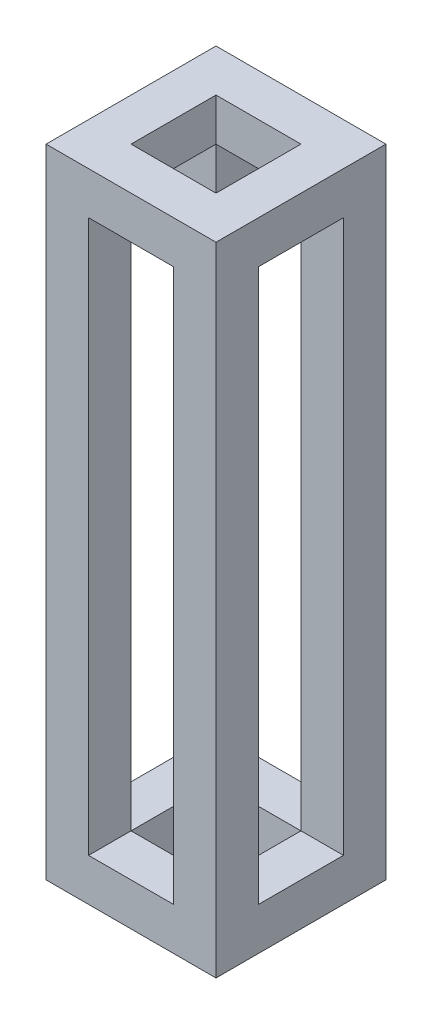
ISO-10303-21;
HEADER;
FILE_DESCRIPTION(('STEP AP214'),'2;1');
FILE_NAME('part.step','',(''),(''),'','','');
FILE_SCHEMA(('AUTOMOTIVE_DESIGN { 1 0 10303 214 1 1 1 1 }'));
ENDSEC;
DATA;
#1=APPLICATION_CONTEXT('core data for automotive mechanical design processes');
#2=APPLICATION_PROTOCOL_DEFINITION('international standard','automotive_design',2000,#1);
#3=PRODUCT_CONTEXT('',#1,'mechanical');
#4=PRODUCT('Part','Part','',(#3));
#5=PRODUCT_RELATED_PRODUCT_CATEGORY('part','',(#4));
#6=PRODUCT_DEFINITION_FORMATION('','',#4);
#7=PRODUCT_DEFINITION_CONTEXT('part definition',#1,'design');
#8=PRODUCT_DEFINITION('design','',#6,#7);
#9=PRODUCT_DEFINITION_SHAPE('','',#8);
#10=(LENGTH_UNIT() NAMED_UNIT(*) SI_UNIT(.MILLI.,.METRE.));
#11=(NAMED_UNIT(*) PLANE_ANGLE_UNIT() SI_UNIT($,.RADIAN.));
#12=(NAMED_UNIT(*) SI_UNIT($,.STERADIAN.) SOLID_ANGLE_UNIT());
#13=UNCERTAINTY_MEASURE_WITH_UNIT(LENGTH_MEASURE(1.E-05),#10,'distance_accuracy_value','');
#14=(GEOMETRIC_REPRESENTATION_CONTEXT(3) GLOBAL_UNCERTAINTY_ASSIGNED_CONTEXT((#13)) GLOBAL_UNIT_ASSIGNED_CONTEXT((#10,
#11,#12)) REPRESENTATION_CONTEXT('',''));
#15=CARTESIAN_POINT('',(0.,0.,0.));
#16=DIRECTION('',(0.,0.,1.));
#17=DIRECTION('',(1.,0.,0.));
#18=AXIS2_PLACEMENT_3D('',#15,#16,#17);
#19=CARTESIAN_POINT('',(-20.,0.,-40.));
#20=DIRECTION('',(1.,0.,0.));
#21=DIRECTION('',(0.,0.,-1.));
#22=AXIS2_PLACEMENT_3D('',#19,#20,#21);
#23=PLANE('',#22);
#24=DIRECTION('',(0.,1.,0.));
#25=VECTOR('',#24,1.);
#26=CARTESIAN_POINT('',(-20.,0.,-40.));
#27=LINE('',#26,#25);
#28=CARTESIAN_POINT('',(-20.,20.,-40.));
#29=VERTEX_POINT('',#28);
#30=CARTESIAN_POINT('',(-20.,280.,-40.));
#31=VERTEX_POINT('',#30);
#32=EDGE_CURVE('E253',#29,#31,#27,.T.);
#33=ORIENTED_EDGE('',*,*,#32,.T.);
#34=DIRECTION('',(0.,0.,1.));
#35=VECTOR('',#34,1.);
#36=CARTESIAN_POINT('',(-20.,280.,-40.));
#37=LINE('',#36,#35);
#38=CARTESIAN_POINT('',(-20.,280.,-20.));
#39=VERTEX_POINT('',#38);
#40=EDGE_CURVE('E246',#31,#39,#37,.T.);
#41=ORIENTED_EDGE('',*,*,#40,.T.);
#42=DIRECTION('',(0.,1.,0.));
#43=VECTOR('',#42,1.);
#44=CARTESIAN_POINT('',(-20.,0.,-20.));
#45=LINE('',#44,#43);
#46=CARTESIAN_POINT('',(-20.,20.,-20.));
#47=VERTEX_POINT('',#46);
#48=EDGE_CURVE('E254',#47,#39,#45,.T.);
#49=ORIENTED_EDGE('',*,*,#48,.F.);
#50=DIRECTION('',(0.,0.,-1.));
#51=VECTOR('',#50,1.);
#52=CARTESIAN_POINT('',(-20.,20.,0.));
#53=LINE('',#52,#51);
#54=EDGE_CURVE('E326',#47,#29,#53,.T.);
#55=ORIENTED_EDGE('',*,*,#54,.T.);
#56=EDGE_LOOP('',(#33,#41,#49,#55));
#57=FACE_BOUND('',#56,.T.);
#58=ADVANCED_FACE('F39',(#57),#23,.T.);
#59=CARTESIAN_POINT('',(-40.,0.,-20.));
#60=DIRECTION('',(0.,0.,1.));
#61=DIRECTION('',(1.,0.,0.));
#62=AXIS2_PLACEMENT_3D('',#59,#60,#61);
#63=PLANE('',#62);
#64=ORIENTED_EDGE('',*,*,#48,.T.);
#65=DIRECTION('',(-1.,0.,0.));
#66=VECTOR('',#65,1.);
#67=CARTESIAN_POINT('',(-40.,280.,-20.));
#68=LINE('',#67,#66);
#69=CARTESIAN_POINT('',(-40.,280.,-20.));
#70=VERTEX_POINT('',#69);
#71=EDGE_CURVE('E371',#39,#70,#68,.T.);
#72=ORIENTED_EDGE('',*,*,#71,.T.);
#73=DIRECTION('',(0.,1.,0.));
#74=VECTOR('',#73,1.);
#75=CARTESIAN_POINT('',(-40.,0.,-20.));
#76=LINE('',#75,#74);
#77=CARTESIAN_POINT('',(-40.,20.,-20.));
#78=VERTEX_POINT('',#77);
#79=EDGE_CURVE('E256',#78,#70,#76,.T.);
#80=ORIENTED_EDGE('',*,*,#79,.F.);
#81=DIRECTION('',(1.,0.,0.));
#82=VECTOR('',#81,1.);
#83=CARTESIAN_POINT('',(0.,20.,-20.));
#84=LINE('',#83,#82);
#85=EDGE_CURVE('E323',#78,#47,#84,.T.);
#86=ORIENTED_EDGE('',*,*,#85,.T.);
#87=EDGE_LOOP('',(#64,#72,#80,#86));
#88=FACE_BOUND('',#87,.T.);
#89=ADVANCED_FACE('F425',(#88),#63,.T.);
#90=CARTESIAN_POINT('',(20.,0.,-20.));
#91=DIRECTION('',(-1.,0.,0.));
#92=DIRECTION('',(0.,0.,1.));
#93=AXIS2_PLACEMENT_3D('',#90,#91,#92);
#94=PLANE('',#93);
#95=DIRECTION('',(0.,1.,0.));
#96=VECTOR('',#95,1.);
#97=CARTESIAN_POINT('',(20.,0.,-20.));
#98=LINE('',#97,#96);
#99=CARTESIAN_POINT('',(20.,20.,-20.));
#100=VERTEX_POINT('',#99);
#101=CARTESIAN_POINT('',(20.,280.,-20.));
#102=VERTEX_POINT('',#101);
#103=EDGE_CURVE('E374',#100,#102,#98,.T.);
#104=ORIENTED_EDGE('',*,*,#103,.T.);
#105=DIRECTION('',(0.,0.,-1.));
#106=VECTOR('',#105,1.);
#107=CARTESIAN_POINT('',(20.,280.,-20.));
#108=LINE('',#107,#106);
#109=CARTESIAN_POINT('',(20.,280.,-40.));
#110=VERTEX_POINT('',#109);
#111=EDGE_CURVE('E366',#102,#110,#108,.T.);
#112=ORIENTED_EDGE('',*,*,#111,.T.);
#113=DIRECTION('',(0.,1.,0.));
#114=VECTOR('',#113,1.);
#115=CARTESIAN_POINT('',(20.,0.,-40.));
#116=LINE('',#115,#114);
#117=CARTESIAN_POINT('',(20.,20.,-40.));
#118=VERTEX_POINT('',#117);
#119=EDGE_CURVE('E239',#118,#110,#116,.T.);
#120=ORIENTED_EDGE('',*,*,#119,.F.);
#121=DIRECTION('',(0.,0.,1.));
#122=VECTOR('',#121,1.);
#123=CARTESIAN_POINT('',(20.,20.,0.));
#124=LINE('',#123,#122);
#125=EDGE_CURVE('E335',#118,#100,#124,.T.);
#126=ORIENTED_EDGE('',*,*,#125,.T.);
#127=EDGE_LOOP('',(#104,#112,#120,#126));
#128=FACE_BOUND('',#127,.T.);
#129=ADVANCED_FACE('F427',(#128),#94,.T.);
#130=CARTESIAN_POINT('',(20.,0.,-20.));
#131=DIRECTION('',(0.,0.,1.));
#132=DIRECTION('',(1.,0.,0.));
#133=AXIS2_PLACEMENT_3D('',#130,#131,#132);
#134=PLANE('',#133);
#135=DIRECTION('',(0.,1.,0.));
#136=VECTOR('',#135,1.);
#137=CARTESIAN_POINT('',(40.,0.,-20.));
#138=LINE('',#137,#136);
#139=CARTESIAN_POINT('',(40.,20.,-20.));
#140=VERTEX_POINT('',#139);
#141=CARTESIAN_POINT('',(40.,280.,-20.));
#142=VERTEX_POINT('',#141);
#143=EDGE_CURVE('E378',#140,#142,#138,.T.);
#144=ORIENTED_EDGE('',*,*,#143,.T.);
#145=DIRECTION('',(-1.,0.,0.));
#146=VECTOR('',#145,1.);
#147=CARTESIAN_POINT('',(20.,280.,-20.));
#148=LINE('',#147,#146);
#149=EDGE_CURVE('E224',#142,#102,#148,.T.);
#150=ORIENTED_EDGE('',*,*,#149,.T.);
#151=ORIENTED_EDGE('',*,*,#103,.F.);
#152=DIRECTION('',(1.,0.,0.));
#153=VECTOR('',#152,1.);
#154=CARTESIAN_POINT('',(0.,20.,-20.));
#155=LINE('',#154,#153);
#156=EDGE_CURVE('E328',#100,#140,#155,.T.);
#157=ORIENTED_EDGE('',*,*,#156,.T.);
#158=EDGE_LOOP('',(#144,#150,#151,#157));
#159=FACE_BOUND('',#158,.T.);
#160=ADVANCED_FACE('F475',(#159),#134,.T.);
#161=CARTESIAN_POINT('',(20.,0.,20.));
#162=DIRECTION('',(-1.,0.,0.));
#163=DIRECTION('',(0.,0.,1.));
#164=AXIS2_PLACEMENT_3D('',#161,#162,#163);
#165=PLANE('',#164);
#166=DIRECTION('',(0.,1.,0.));
#167=VECTOR('',#166,1.);
#168=CARTESIAN_POINT('',(20.,0.,40.));
#169=LINE('',#168,#167);
#170=CARTESIAN_POINT('',(20.,20.,40.));
#171=VERTEX_POINT('',#170);
#172=CARTESIAN_POINT('',(20.,280.,40.));
#173=VERTEX_POINT('',#172);
#174=EDGE_CURVE('E225',#171,#173,#169,.T.);
#175=ORIENTED_EDGE('',*,*,#174,.T.);
#176=DIRECTION('',(0.,0.,-1.));
#177=VECTOR('',#176,1.);
#178=CARTESIAN_POINT('',(20.,280.,20.));
#179=LINE('',#178,#177);
#180=CARTESIAN_POINT('',(20.,280.,20.));
#181=VERTEX_POINT('',#180);
#182=EDGE_CURVE('E181',#173,#181,#179,.T.);
#183=ORIENTED_EDGE('',*,*,#182,.T.);
#184=DIRECTION('',(0.,1.,0.));
#185=VECTOR('',#184,1.);
#186=CARTESIAN_POINT('',(20.,0.,20.));
#187=LINE('',#186,#185);
#188=CARTESIAN_POINT('',(20.,20.,20.));
#189=VERTEX_POINT('',#188);
#190=EDGE_CURVE('E219',#189,#181,#187,.T.);
#191=ORIENTED_EDGE('',*,*,#190,.F.);
#192=DIRECTION('',(0.,0.,1.));
#193=VECTOR('',#192,1.);
#194=CARTESIAN_POINT('',(20.,20.,0.));
#195=LINE('',#194,#193);
#196=EDGE_CURVE('E336',#189,#171,#195,.T.);
#197=ORIENTED_EDGE('',*,*,#196,.T.);
#198=EDGE_LOOP('',(#175,#183,#191,#197));
#199=FACE_BOUND('',#198,.T.);
#200=ADVANCED_FACE('F217',(#199),#165,.T.);
#201=CARTESIAN_POINT('',(20.,0.,20.));
#202=DIRECTION('',(0.,0.,-1.));
#203=DIRECTION('',(-1.,0.,0.));
#204=AXIS2_PLACEMENT_3D('',#201,#202,#203);
#205=PLANE('',#204);
#206=ORIENTED_EDGE('',*,*,#190,.T.);
#207=DIRECTION('',(1.,0.,0.));
#208=VECTOR('',#207,1.);
#209=CARTESIAN_POINT('',(20.,280.,20.));
#210=LINE('',#209,#208);
#211=CARTESIAN_POINT('',(40.,280.,20.));
#212=VERTEX_POINT('',#211);
#213=EDGE_CURVE('E173',#181,#212,#210,.T.);
#214=ORIENTED_EDGE('',*,*,#213,.T.);
#215=DIRECTION('',(0.,1.,0.));
#216=VECTOR('',#215,1.);
#217=CARTESIAN_POINT('',(40.,0.,20.));
#218=LINE('',#217,#216);
#219=CARTESIAN_POINT('',(40.,20.,20.));
#220=VERTEX_POINT('',#219);
#221=EDGE_CURVE('E229',#220,#212,#218,.T.);
#222=ORIENTED_EDGE('',*,*,#221,.F.);
#223=DIRECTION('',(-1.,0.,0.));
#224=VECTOR('',#223,1.);
#225=CARTESIAN_POINT('',(0.,20.,20.));
#226=LINE('',#225,#224);
#227=EDGE_CURVE('E227',#220,#189,#226,.T.);
#228=ORIENTED_EDGE('',*,*,#227,.T.);
#229=EDGE_LOOP('',(#206,#214,#222,#228));
#230=FACE_BOUND('',#229,.T.);
#231=ADVANCED_FACE('F226',(#230),#205,.T.);
#232=CARTESIAN_POINT('',(-20.,0.,20.));
#233=DIRECTION('',(1.,0.,0.));
#234=DIRECTION('',(0.,0.,-1.));
#235=AXIS2_PLACEMENT_3D('',#232,#233,#234);
#236=PLANE('',#235);
#237=DIRECTION('',(0.,1.,0.));
#238=VECTOR('',#237,1.);
#239=CARTESIAN_POINT('',(-20.,0.,20.));
#240=LINE('',#239,#238);
#241=CARTESIAN_POINT('',(-20.,20.,20.));
#242=VERTEX_POINT('',#241);
#243=CARTESIAN_POINT('',(-20.,280.,20.));
#244=VERTEX_POINT('',#243);
#245=EDGE_CURVE('E238',#242,#244,#240,.T.);
#246=ORIENTED_EDGE('',*,*,#245,.T.);
#247=DIRECTION('',(0.,0.,1.));
#248=VECTOR('',#247,1.);
#249=CARTESIAN_POINT('',(-20.,280.,20.));
#250=LINE('',#249,#248);
#251=CARTESIAN_POINT('',(-20.,280.,40.));
#252=VERTEX_POINT('',#251);
#253=EDGE_CURVE('E184',#244,#252,#250,.T.);
#254=ORIENTED_EDGE('',*,*,#253,.T.);
#255=DIRECTION('',(0.,1.,0.));
#256=VECTOR('',#255,1.);
#257=CARTESIAN_POINT('',(-20.,0.,40.));
#258=LINE('',#257,#256);
#259=CARTESIAN_POINT('',(-20.,20.,40.));
#260=VERTEX_POINT('',#259);
#261=EDGE_CURVE('E247',#260,#252,#258,.T.);
#262=ORIENTED_EDGE('',*,*,#261,.F.);
#263=DIRECTION('',(0.,0.,-1.));
#264=VECTOR('',#263,1.);
#265=CARTESIAN_POINT('',(-20.,20.,0.));
#266=LINE('',#265,#264);
#267=EDGE_CURVE('E50',#260,#242,#266,.T.);
#268=ORIENTED_EDGE('',*,*,#267,.T.);
#269=EDGE_LOOP('',(#246,#254,#262,#268));
#270=FACE_BOUND('',#269,.T.);
#271=ADVANCED_FACE('F341',(#270),#236,.T.);
#272=CARTESIAN_POINT('',(-20.,0.,20.));
#273=DIRECTION('',(0.,0.,-1.));
#274=DIRECTION('',(-1.,0.,0.));
#275=AXIS2_PLACEMENT_3D('',#272,#273,#274);
#276=PLANE('',#275);
#277=DIRECTION('',(0.,1.,0.));
#278=VECTOR('',#277,1.);
#279=CARTESIAN_POINT('',(-40.,0.,20.));
#280=LINE('',#279,#278);
#281=CARTESIAN_POINT('',(-40.,20.,20.));
#282=VERTEX_POINT('',#281);
#283=CARTESIAN_POINT('',(-40.,280.,20.));
#284=VERTEX_POINT('',#283);
#285=EDGE_CURVE('E244',#282,#284,#280,.T.);
#286=ORIENTED_EDGE('',*,*,#285,.T.);
#287=DIRECTION('',(1.,0.,0.));
#288=VECTOR('',#287,1.);
#289=CARTESIAN_POINT('',(-20.,280.,20.));
#290=LINE('',#289,#288);
#291=EDGE_CURVE('E11',#284,#244,#290,.T.);
#292=ORIENTED_EDGE('',*,*,#291,.T.);
#293=ORIENTED_EDGE('',*,*,#245,.F.);
#294=DIRECTION('',(-1.,0.,0.));
#295=VECTOR('',#294,1.);
#296=CARTESIAN_POINT('',(0.,20.,20.));
#297=LINE('',#296,#295);
#298=EDGE_CURVE('E339',#242,#282,#297,.T.);
#299=ORIENTED_EDGE('',*,*,#298,.T.);
#300=EDGE_LOOP('',(#286,#292,#293,#299));
#301=FACE_BOUND('',#300,.T.);
#302=ADVANCED_FACE('F349',(#301),#276,.T.);
#303=CARTESIAN_POINT('',(0.,20.,0.));
#304=DIRECTION('',(0.,1.,0.));
#305=DIRECTION('',(0.,0.,1.));
#306=AXIS2_PLACEMENT_3D('',#303,#304,#305);
#307=PLANE('',#306);
#308=ORIENTED_EDGE('',*,*,#267,.F.);
#309=DIRECTION('',(1.,0.,0.));
#310=VECTOR('',#309,1.);
#311=CARTESIAN_POINT('',(-40.,20.,40.));
#312=LINE('',#311,#310);
#313=EDGE_CURVE('E305',#260,#171,#312,.T.);
#314=ORIENTED_EDGE('',*,*,#313,.T.);
#315=ORIENTED_EDGE('',*,*,#196,.F.);
#316=DIRECTION('',(1.,0.,0.));
#317=VECTOR('',#316,1.);
#318=CARTESIAN_POINT('',(-20.,20.,20.));
#319=LINE('',#318,#317);
#320=EDGE_CURVE('E275',#242,#189,#319,.T.);
#321=ORIENTED_EDGE('',*,*,#320,.F.);
#322=EDGE_LOOP('',(#308,#314,#315,#321));
#323=FACE_BOUND('',#322,.T.);
#324=ADVANCED_FACE('F420',(#323),#307,.T.);
#325=ORIENTED_EDGE('',*,*,#298,.F.);
#326=DIRECTION('',(0.,0.,1.));
#327=VECTOR('',#326,1.);
#328=CARTESIAN_POINT('',(-20.,20.,-20.));
#329=LINE('',#328,#327);
#330=EDGE_CURVE('E267',#47,#242,#329,.T.);
#331=ORIENTED_EDGE('',*,*,#330,.F.);
#332=ORIENTED_EDGE('',*,*,#85,.F.);
#333=DIRECTION('',(0.,0.,1.));
#334=VECTOR('',#333,1.);
#335=CARTESIAN_POINT('',(-40.,20.,-40.));
#336=LINE('',#335,#334);
#337=EDGE_CURVE('E302',#78,#282,#336,.T.);
#338=ORIENTED_EDGE('',*,*,#337,.T.);
#339=EDGE_LOOP('',(#325,#331,#332,#338));
#340=FACE_BOUND('',#339,.T.);
#341=ADVANCED_FACE('F458',(#340),#307,.T.);
#342=ORIENTED_EDGE('',*,*,#125,.F.);
#343=DIRECTION('',(-1.,0.,0.));
#344=VECTOR('',#343,1.);
#345=CARTESIAN_POINT('',(-40.,20.,-40.));
#346=LINE('',#345,#344);
#347=EDGE_CURVE('E299',#118,#29,#346,.T.);
#348=ORIENTED_EDGE('',*,*,#347,.T.);
#349=ORIENTED_EDGE('',*,*,#54,.F.);
#350=DIRECTION('',(-1.,0.,0.));
#351=VECTOR('',#350,1.);
#352=CARTESIAN_POINT('',(-20.,20.,-20.));
#353=LINE('',#352,#351);
#354=EDGE_CURVE('E264',#100,#47,#353,.T.);
#355=ORIENTED_EDGE('',*,*,#354,.F.);
#356=EDGE_LOOP('',(#342,#348,#349,#355));
#357=FACE_BOUND('',#356,.T.);
#358=ADVANCED_FACE('F418',(#357),#307,.T.);
#359=ORIENTED_EDGE('',*,*,#227,.F.);
#360=DIRECTION('',(0.,0.,-1.));
#361=VECTOR('',#360,1.);
#362=CARTESIAN_POINT('',(40.,20.,-40.));
#363=LINE('',#362,#361);
#364=EDGE_CURVE('E296',#220,#140,#363,.T.);
#365=ORIENTED_EDGE('',*,*,#364,.T.);
#366=ORIENTED_EDGE('',*,*,#156,.F.);
#367=DIRECTION('',(0.,0.,-1.));
#368=VECTOR('',#367,1.);
#369=CARTESIAN_POINT('',(20.,20.,-20.));
#370=LINE('',#369,#368);
#371=EDGE_CURVE('E265',#189,#100,#370,.T.);
#372=ORIENTED_EDGE('',*,*,#371,.F.);
#373=EDGE_LOOP('',(#359,#365,#366,#372));
#374=FACE_BOUND('',#373,.T.);
#375=ADVANCED_FACE('F409',(#374),#307,.T.);
#376=CARTESIAN_POINT('',(0.,0.,0.));
#377=DIRECTION('',(0.,1.,0.));
#378=DIRECTION('',(0.,0.,1.));
#379=AXIS2_PLACEMENT_3D('',#376,#377,#378);
#380=PLANE('',#379);
#381=DIRECTION('',(0.,0.,1.));
#382=VECTOR('',#381,1.);
#383=CARTESIAN_POINT('',(-20.,0.,-20.));
#384=LINE('',#383,#382);
#385=CARTESIAN_POINT('',(-20.,0.,-20.));
#386=VERTEX_POINT('',#385);
#387=CARTESIAN_POINT('',(-20.,0.,20.));
#388=VERTEX_POINT('',#387);
#389=EDGE_CURVE('E281',#386,#388,#384,.T.);
#390=ORIENTED_EDGE('',*,*,#389,.T.);
#391=DIRECTION('',(1.,0.,0.));
#392=VECTOR('',#391,1.);
#393=CARTESIAN_POINT('',(-20.,0.,20.));
#394=LINE('',#393,#392);
#395=CARTESIAN_POINT('',(20.,0.,20.));
#396=VERTEX_POINT('',#395);
#397=EDGE_CURVE('E266',#388,#396,#394,.T.);
#398=ORIENTED_EDGE('',*,*,#397,.T.);
#399=DIRECTION('',(0.,0.,-1.));
#400=VECTOR('',#399,1.);
#401=CARTESIAN_POINT('',(20.,0.,-20.));
#402=LINE('',#401,#400);
#403=CARTESIAN_POINT('',(20.,0.,-20.));
#404=VERTEX_POINT('',#403);
#405=EDGE_CURVE('E255',#396,#404,#402,.T.);
#406=ORIENTED_EDGE('',*,*,#405,.T.);
#407=DIRECTION('',(-1.,0.,0.));
#408=VECTOR('',#407,1.);
#409=CARTESIAN_POINT('',(-20.,0.,-20.));
#410=LINE('',#409,#408);
#411=EDGE_CURVE('E279',#404,#386,#410,.T.);
#412=ORIENTED_EDGE('',*,*,#411,.T.);
#413=EDGE_LOOP('',(#390,#398,#406,#412));
#414=FACE_BOUND('',#413,.T.);
#415=DIRECTION('',(-1.,0.,0.));
#416=VECTOR('',#415,1.);
#417=CARTESIAN_POINT('',(-40.,0.,-40.));
#418=LINE('',#417,#416);
#419=CARTESIAN_POINT('',(40.,0.,-40.));
#420=VERTEX_POINT('',#419);
#421=CARTESIAN_POINT('',(-40.,0.,-40.));
#422=VERTEX_POINT('',#421);
#423=EDGE_CURVE('E306',#420,#422,#418,.T.);
#424=ORIENTED_EDGE('',*,*,#423,.F.);
#425=DIRECTION('',(0.,0.,-1.));
#426=VECTOR('',#425,1.);
#427=CARTESIAN_POINT('',(40.,0.,-40.));
#428=LINE('',#427,#426);
#429=CARTESIAN_POINT('',(40.,0.,40.));
#430=VERTEX_POINT('',#429);
#431=EDGE_CURVE('E293',#430,#420,#428,.T.);
#432=ORIENTED_EDGE('',*,*,#431,.F.);
#433=DIRECTION('',(1.,0.,0.));
#434=VECTOR('',#433,1.);
#435=CARTESIAN_POINT('',(-40.,0.,40.));
#436=LINE('',#435,#434);
#437=CARTESIAN_POINT('',(-40.,0.,40.));
#438=VERTEX_POINT('',#437);
#439=EDGE_CURVE('E298',#438,#430,#436,.T.);
#440=ORIENTED_EDGE('',*,*,#439,.F.);
#441=DIRECTION('',(0.,0.,1.));
#442=VECTOR('',#441,1.);
#443=CARTESIAN_POINT('',(-40.,0.,-40.));
#444=LINE('',#443,#442);
#445=EDGE_CURVE('E313',#422,#438,#444,.T.);
#446=ORIENTED_EDGE('',*,*,#445,.F.);
#447=EDGE_LOOP('',(#424,#432,#440,#446));
#448=FACE_BOUND('',#447,.T.);
#449=ADVANCED_FACE('F406',(#414,#448),#380,.F.);
#450=CARTESIAN_POINT('',(40.,20.,-40.));
#451=DIRECTION('',(-1.,0.,0.));
#452=DIRECTION('',(0.,0.,1.));
#453=AXIS2_PLACEMENT_3D('',#450,#451,#452);
#454=PLANE('',#453);
#455=DIRECTION('',(0.,-1.,0.));
#456=VECTOR('',#455,1.);
#457=CARTESIAN_POINT('',(40.,20.,-40.));
#458=LINE('',#457,#456);
#459=CARTESIAN_POINT('',(40.,300.,-40.));
#460=VERTEX_POINT('',#459);
#461=EDGE_CURVE('E321',#460,#420,#458,.T.);
#462=ORIENTED_EDGE('',*,*,#461,.F.);
#463=DIRECTION('',(0.,0.,-1.));
#464=VECTOR('',#463,1.);
#465=CARTESIAN_POINT('',(40.,300.,20.));
#466=LINE('',#465,#464);
#467=CARTESIAN_POINT('',(40.,300.,40.));
#468=VERTEX_POINT('',#467);
#469=EDGE_CURVE('E240',#468,#460,#466,.T.);
#470=ORIENTED_EDGE('',*,*,#469,.F.);
#471=DIRECTION('',(0.,-1.,0.));
#472=VECTOR('',#471,1.);
#473=CARTESIAN_POINT('',(40.,20.,40.));
#474=LINE('',#473,#472);
#475=EDGE_CURVE('E303',#468,#430,#474,.T.);
#476=ORIENTED_EDGE('',*,*,#475,.T.);
#477=ORIENTED_EDGE('',*,*,#431,.T.);
#478=EDGE_LOOP('',(#462,#470,#476,#477));
#479=FACE_BOUND('',#478,.T.);
#480=DIRECTION('',(0.,0.,-1.));
#481=VECTOR('',#480,1.);
#482=CARTESIAN_POINT('',(40.,280.,-40.));
#483=LINE('',#482,#481);
#484=EDGE_CURVE('E180',#212,#142,#483,.T.);
#485=ORIENTED_EDGE('',*,*,#484,.T.);
#486=ORIENTED_EDGE('',*,*,#143,.F.);
#487=ORIENTED_EDGE('',*,*,#364,.F.);
#488=ORIENTED_EDGE('',*,*,#221,.T.);
#489=EDGE_LOOP('',(#485,#486,#487,#488));
#490=FACE_BOUND('',#489,.T.);
#491=ADVANCED_FACE('F41',(#479,#490),#454,.F.);
#492=CARTESIAN_POINT('',(-40.,20.,-40.));
#493=DIRECTION('',(0.,0.,1.));
#494=DIRECTION('',(1.,0.,0.));
#495=AXIS2_PLACEMENT_3D('',#492,#493,#494);
#496=PLANE('',#495);
#497=DIRECTION('',(0.,-1.,0.));
#498=VECTOR('',#497,1.);
#499=CARTESIAN_POINT('',(-40.,20.,-40.));
#500=LINE('',#499,#498);
#501=CARTESIAN_POINT('',(-40.,300.,-40.));
#502=VERTEX_POINT('',#501);
#503=EDGE_CURVE('E317',#502,#422,#500,.T.);
#504=ORIENTED_EDGE('',*,*,#503,.F.);
#505=DIRECTION('',(-1.,0.,0.));
#506=VECTOR('',#505,1.);
#507=CARTESIAN_POINT('',(20.,300.,-40.));
#508=LINE('',#507,#506);
#509=EDGE_CURVE('E261',#460,#502,#508,.T.);
#510=ORIENTED_EDGE('',*,*,#509,.F.);
#511=ORIENTED_EDGE('',*,*,#461,.T.);
#512=ORIENTED_EDGE('',*,*,#423,.T.);
#513=EDGE_LOOP('',(#504,#510,#511,#512));
#514=FACE_BOUND('',#513,.T.);
#515=DIRECTION('',(-1.,0.,0.));
#516=VECTOR('',#515,1.);
#517=CARTESIAN_POINT('',(-40.,280.,-40.));
#518=LINE('',#517,#516);
#519=EDGE_CURVE('E360',#110,#31,#518,.T.);
#520=ORIENTED_EDGE('',*,*,#519,.T.);
#521=ORIENTED_EDGE('',*,*,#32,.F.);
#522=ORIENTED_EDGE('',*,*,#347,.F.);
#523=ORIENTED_EDGE('',*,*,#119,.T.);
#524=EDGE_LOOP('',(#520,#521,#522,#523));
#525=FACE_BOUND('',#524,.T.);
#526=ADVANCED_FACE('F392',(#514,#525),#496,.F.);
#527=CARTESIAN_POINT('',(-40.,20.,-40.));
#528=DIRECTION('',(1.,0.,0.));
#529=DIRECTION('',(0.,0.,-1.));
#530=AXIS2_PLACEMENT_3D('',#527,#528,#529);
#531=PLANE('',#530);
#532=DIRECTION('',(0.,0.,1.));
#533=VECTOR('',#532,1.);
#534=CARTESIAN_POINT('',(-40.,300.,20.));
#535=LINE('',#534,#533);
#536=CARTESIAN_POINT('',(-40.,300.,40.));
#537=VERTEX_POINT('',#536);
#538=EDGE_CURVE('E228',#502,#537,#535,.T.);
#539=ORIENTED_EDGE('',*,*,#538,.F.);
#540=ORIENTED_EDGE('',*,*,#503,.T.);
#541=ORIENTED_EDGE('',*,*,#445,.T.);
#542=DIRECTION('',(0.,-1.,0.));
#543=VECTOR('',#542,1.);
#544=CARTESIAN_POINT('',(-40.,20.,40.));
#545=LINE('',#544,#543);
#546=EDGE_CURVE('E320',#537,#438,#545,.T.);
#547=ORIENTED_EDGE('',*,*,#546,.F.);
#548=EDGE_LOOP('',(#539,#540,#541,#547));
#549=FACE_BOUND('',#548,.T.);
#550=DIRECTION('',(0.,0.,1.));
#551=VECTOR('',#550,1.);
#552=CARTESIAN_POINT('',(-40.,280.,-40.));
#553=LINE('',#552,#551);
#554=EDGE_CURVE('E53',#70,#284,#553,.T.);
#555=ORIENTED_EDGE('',*,*,#554,.T.);
#556=ORIENTED_EDGE('',*,*,#285,.F.);
#557=ORIENTED_EDGE('',*,*,#337,.F.);
#558=ORIENTED_EDGE('',*,*,#79,.T.);
#559=EDGE_LOOP('',(#555,#556,#557,#558));
#560=FACE_BOUND('',#559,.T.);
#561=ADVANCED_FACE('F353',(#549,#560),#531,.F.);
#562=CARTESIAN_POINT('',(-40.,20.,40.));
#563=DIRECTION('',(0.,0.,-1.));
#564=DIRECTION('',(-1.,0.,0.));
#565=AXIS2_PLACEMENT_3D('',#562,#563,#564);
#566=PLANE('',#565);
#567=ORIENTED_EDGE('',*,*,#475,.F.);
#568=DIRECTION('',(1.,0.,0.));
#569=VECTOR('',#568,1.);
#570=CARTESIAN_POINT('',(-20.,300.,40.));
#571=LINE('',#570,#569);
#572=EDGE_CURVE('E235',#537,#468,#571,.T.);
#573=ORIENTED_EDGE('',*,*,#572,.F.);
#574=ORIENTED_EDGE('',*,*,#546,.T.);
#575=ORIENTED_EDGE('',*,*,#439,.T.);
#576=EDGE_LOOP('',(#567,#573,#574,#575));
#577=FACE_BOUND('',#576,.T.);
#578=DIRECTION('',(1.,0.,0.));
#579=VECTOR('',#578,1.);
#580=CARTESIAN_POINT('',(-40.,280.,40.));
#581=LINE('',#580,#579);
#582=EDGE_CURVE('E359',#252,#173,#581,.T.);
#583=ORIENTED_EDGE('',*,*,#582,.T.);
#584=ORIENTED_EDGE('',*,*,#174,.F.);
#585=ORIENTED_EDGE('',*,*,#313,.F.);
#586=ORIENTED_EDGE('',*,*,#261,.T.);
#587=EDGE_LOOP('',(#583,#584,#585,#586));
#588=FACE_BOUND('',#587,.T.);
#589=ADVANCED_FACE('F398',(#577,#588),#566,.F.);
#590=CARTESIAN_POINT('',(20.,20.,-20.));
#591=DIRECTION('',(-1.,0.,0.));
#592=DIRECTION('',(0.,0.,1.));
#593=AXIS2_PLACEMENT_3D('',#590,#591,#592);
#594=PLANE('',#593);
#595=ORIENTED_EDGE('',*,*,#405,.F.);
#596=DIRECTION('',(0.,-1.,0.));
#597=VECTOR('',#596,1.);
#598=CARTESIAN_POINT('',(20.,20.,20.));
#599=LINE('',#598,#597);
#600=EDGE_CURVE('E274',#189,#396,#599,.T.);
#601=ORIENTED_EDGE('',*,*,#600,.F.);
#602=ORIENTED_EDGE('',*,*,#371,.T.);
#603=DIRECTION('',(0.,-1.,0.));
#604=VECTOR('',#603,1.);
#605=CARTESIAN_POINT('',(20.,20.,-20.));
#606=LINE('',#605,#604);
#607=EDGE_CURVE('E295',#100,#404,#606,.T.);
#608=ORIENTED_EDGE('',*,*,#607,.T.);
#609=EDGE_LOOP('',(#595,#601,#602,#608));
#610=FACE_BOUND('',#609,.T.);
#611=ADVANCED_FACE('F443',(#610),#594,.T.);
#612=CARTESIAN_POINT('',(-20.,20.,-20.));
#613=DIRECTION('',(0.,0.,1.));
#614=DIRECTION('',(1.,0.,0.));
#615=AXIS2_PLACEMENT_3D('',#612,#613,#614);
#616=PLANE('',#615);
#617=ORIENTED_EDGE('',*,*,#411,.F.);
#618=ORIENTED_EDGE('',*,*,#607,.F.);
#619=ORIENTED_EDGE('',*,*,#354,.T.);
#620=DIRECTION('',(0.,-1.,0.));
#621=VECTOR('',#620,1.);
#622=CARTESIAN_POINT('',(-20.,20.,-20.));
#623=LINE('',#622,#621);
#624=EDGE_CURVE('E288',#47,#386,#623,.T.);
#625=ORIENTED_EDGE('',*,*,#624,.T.);
#626=EDGE_LOOP('',(#617,#618,#619,#625));
#627=FACE_BOUND('',#626,.T.);
#628=ADVANCED_FACE('F442',(#627),#616,.T.);
#629=CARTESIAN_POINT('',(-20.,20.,-20.));
#630=DIRECTION('',(1.,0.,0.));
#631=DIRECTION('',(0.,0.,-1.));
#632=AXIS2_PLACEMENT_3D('',#629,#630,#631);
#633=PLANE('',#632);
#634=ORIENTED_EDGE('',*,*,#389,.F.);
#635=ORIENTED_EDGE('',*,*,#624,.F.);
#636=ORIENTED_EDGE('',*,*,#330,.T.);
#637=DIRECTION('',(0.,-1.,0.));
#638=VECTOR('',#637,1.);
#639=CARTESIAN_POINT('',(-20.,20.,20.));
#640=LINE('',#639,#638);
#641=EDGE_CURVE('E290',#242,#388,#640,.T.);
#642=ORIENTED_EDGE('',*,*,#641,.T.);
#643=EDGE_LOOP('',(#634,#635,#636,#642));
#644=FACE_BOUND('',#643,.T.);
#645=ADVANCED_FACE('F440',(#644),#633,.T.);
#646=CARTESIAN_POINT('',(-20.,20.,20.));
#647=DIRECTION('',(0.,0.,-1.));
#648=DIRECTION('',(-1.,0.,0.));
#649=AXIS2_PLACEMENT_3D('',#646,#647,#648);
#650=PLANE('',#649);
#651=ORIENTED_EDGE('',*,*,#397,.F.);
#652=ORIENTED_EDGE('',*,*,#641,.F.);
#653=ORIENTED_EDGE('',*,*,#320,.T.);
#654=ORIENTED_EDGE('',*,*,#600,.T.);
#655=EDGE_LOOP('',(#651,#652,#653,#654));
#656=FACE_BOUND('',#655,.T.);
#657=ADVANCED_FACE('F434',(#656),#650,.T.);
#658=CARTESIAN_POINT('',(0.,300.,0.));
#659=DIRECTION('',(0.,-1.,0.));
#660=DIRECTION('',(0.,0.,-1.));
#661=AXIS2_PLACEMENT_3D('',#658,#659,#660);
#662=PLANE('',#661);
#663=DIRECTION('',(0.,0.,1.));
#664=VECTOR('',#663,1.);
#665=CARTESIAN_POINT('',(-20.,300.,-20.));
#666=LINE('',#665,#664);
#667=CARTESIAN_POINT('',(-20.,300.,-20.));
#668=VERTEX_POINT('',#667);
#669=CARTESIAN_POINT('',(-20.,300.,20.));
#670=VERTEX_POINT('',#669);
#671=EDGE_CURVE('E738',#668,#670,#666,.T.);
#672=ORIENTED_EDGE('',*,*,#671,.F.);
#673=DIRECTION('',(-1.,0.,0.));
#674=VECTOR('',#673,1.);
#675=CARTESIAN_POINT('',(-20.,300.,-20.));
#676=LINE('',#675,#674);
#677=CARTESIAN_POINT('',(20.,300.,-20.));
#678=VERTEX_POINT('',#677);
#679=EDGE_CURVE('E744',#678,#668,#676,.T.);
#680=ORIENTED_EDGE('',*,*,#679,.F.);
#681=DIRECTION('',(0.,0.,-1.));
#682=VECTOR('',#681,1.);
#683=CARTESIAN_POINT('',(20.,300.,-20.));
#684=LINE('',#683,#682);
#685=CARTESIAN_POINT('',(20.,300.,20.));
#686=VERTEX_POINT('',#685);
#687=EDGE_CURVE('E743',#686,#678,#684,.T.);
#688=ORIENTED_EDGE('',*,*,#687,.F.);
#689=DIRECTION('',(1.,0.,0.));
#690=VECTOR('',#689,1.);
#691=CARTESIAN_POINT('',(-20.,300.,20.));
#692=LINE('',#691,#690);
#693=EDGE_CURVE('E193',#670,#686,#692,.T.);
#694=ORIENTED_EDGE('',*,*,#693,.F.);
#695=EDGE_LOOP('',(#672,#680,#688,#694));
#696=FACE_BOUND('',#695,.T.);
#697=ORIENTED_EDGE('',*,*,#572,.T.);
#698=ORIENTED_EDGE('',*,*,#469,.T.);
#699=ORIENTED_EDGE('',*,*,#509,.T.);
#700=ORIENTED_EDGE('',*,*,#538,.T.);
#701=EDGE_LOOP('',(#697,#698,#699,#700));
#702=FACE_BOUND('',#701,.T.);
#703=ADVANCED_FACE('F390',(#696,#702),#662,.F.);
#704=CARTESIAN_POINT('',(0.,280.,0.));
#705=DIRECTION('',(0.,1.,0.));
#706=DIRECTION('',(0.,0.,1.));
#707=AXIS2_PLACEMENT_3D('',#704,#705,#706);
#708=PLANE('',#707);
#709=ORIENTED_EDGE('',*,*,#40,.F.);
#710=ORIENTED_EDGE('',*,*,#519,.F.);
#711=ORIENTED_EDGE('',*,*,#111,.F.);
#712=DIRECTION('',(-1.,0.,0.));
#713=VECTOR('',#712,1.);
#714=CARTESIAN_POINT('',(-20.,280.,-20.));
#715=LINE('',#714,#713);
#716=EDGE_CURVE('E202',#102,#39,#715,.T.);
#717=ORIENTED_EDGE('',*,*,#716,.T.);
#718=EDGE_LOOP('',(#709,#710,#711,#717));
#719=FACE_BOUND('',#718,.T.);
#720=ADVANCED_FACE('F483',(#719),#708,.F.);
#721=ORIENTED_EDGE('',*,*,#71,.F.);
#722=DIRECTION('',(0.,0.,1.));
#723=VECTOR('',#722,1.);
#724=CARTESIAN_POINT('',(-20.,280.,-20.));
#725=LINE('',#724,#723);
#726=EDGE_CURVE('E213',#39,#244,#725,.T.);
#727=ORIENTED_EDGE('',*,*,#726,.T.);
#728=ORIENTED_EDGE('',*,*,#291,.F.);
#729=ORIENTED_EDGE('',*,*,#554,.F.);
#730=EDGE_LOOP('',(#721,#727,#728,#729));
#731=FACE_BOUND('',#730,.T.);
#732=ADVANCED_FACE('F351',(#731),#708,.F.);
#733=ORIENTED_EDGE('',*,*,#182,.F.);
#734=ORIENTED_EDGE('',*,*,#582,.F.);
#735=ORIENTED_EDGE('',*,*,#253,.F.);
#736=DIRECTION('',(1.,0.,0.));
#737=VECTOR('',#736,1.);
#738=CARTESIAN_POINT('',(-20.,280.,20.));
#739=LINE('',#738,#737);
#740=EDGE_CURVE('E194',#244,#181,#739,.T.);
#741=ORIENTED_EDGE('',*,*,#740,.T.);
#742=EDGE_LOOP('',(#733,#734,#735,#741));
#743=FACE_BOUND('',#742,.T.);
#744=ADVANCED_FACE('F209',(#743),#708,.F.);
#745=ORIENTED_EDGE('',*,*,#149,.F.);
#746=ORIENTED_EDGE('',*,*,#484,.F.);
#747=ORIENTED_EDGE('',*,*,#213,.F.);
#748=DIRECTION('',(0.,0.,-1.));
#749=VECTOR('',#748,1.);
#750=CARTESIAN_POINT('',(20.,280.,-20.));
#751=LINE('',#750,#749);
#752=EDGE_CURVE('E62',#181,#102,#751,.T.);
#753=ORIENTED_EDGE('',*,*,#752,.T.);
#754=EDGE_LOOP('',(#745,#746,#747,#753));
#755=FACE_BOUND('',#754,.T.);
#756=ADVANCED_FACE('F177',(#755),#708,.F.);
#757=CARTESIAN_POINT('',(20.,280.,-20.));
#758=DIRECTION('',(1.,0.,0.));
#759=DIRECTION('',(0.,0.,-1.));
#760=AXIS2_PLACEMENT_3D('',#757,#758,#759);
#761=PLANE('',#760);
#762=ORIENTED_EDGE('',*,*,#687,.T.);
#763=DIRECTION('',(0.,1.,0.));
#764=VECTOR('',#763,1.);
#765=CARTESIAN_POINT('',(20.,280.,-20.));
#766=LINE('',#765,#764);
#767=EDGE_CURVE('E201',#102,#678,#766,.T.);
#768=ORIENTED_EDGE('',*,*,#767,.F.);
#769=ORIENTED_EDGE('',*,*,#752,.F.);
#770=DIRECTION('',(0.,1.,0.));
#771=VECTOR('',#770,1.);
#772=CARTESIAN_POINT('',(20.,280.,20.));
#773=LINE('',#772,#771);
#774=EDGE_CURVE('E188',#181,#686,#773,.T.);
#775=ORIENTED_EDGE('',*,*,#774,.T.);
#776=EDGE_LOOP('',(#762,#768,#769,#775));
#777=FACE_BOUND('',#776,.T.);
#778=ADVANCED_FACE('F203',(#777),#761,.F.);
#779=CARTESIAN_POINT('',(-20.,280.,20.));
#780=DIRECTION('',(0.,0.,1.));
#781=DIRECTION('',(1.,0.,0.));
#782=AXIS2_PLACEMENT_3D('',#779,#780,#781);
#783=PLANE('',#782);
#784=ORIENTED_EDGE('',*,*,#693,.T.);
#785=ORIENTED_EDGE('',*,*,#774,.F.);
#786=ORIENTED_EDGE('',*,*,#740,.F.);
#787=DIRECTION('',(0.,1.,0.));
#788=VECTOR('',#787,1.);
#789=CARTESIAN_POINT('',(-20.,280.,20.));
#790=LINE('',#789,#788);
#791=EDGE_CURVE('E196',#244,#670,#790,.T.);
#792=ORIENTED_EDGE('',*,*,#791,.T.);
#793=EDGE_LOOP('',(#784,#785,#786,#792));
#794=FACE_BOUND('',#793,.T.);
#795=ADVANCED_FACE('F190',(#794),#783,.F.);
#796=CARTESIAN_POINT('',(-20.,280.,-20.));
#797=DIRECTION('',(-1.,0.,0.));
#798=DIRECTION('',(0.,0.,1.));
#799=AXIS2_PLACEMENT_3D('',#796,#797,#798);
#800=PLANE('',#799);
#801=ORIENTED_EDGE('',*,*,#671,.T.);
#802=ORIENTED_EDGE('',*,*,#791,.F.);
#803=ORIENTED_EDGE('',*,*,#726,.F.);
#804=DIRECTION('',(0.,1.,0.));
#805=VECTOR('',#804,1.);
#806=CARTESIAN_POINT('',(-20.,280.,-20.));
#807=LINE('',#806,#805);
#808=EDGE_CURVE('E733',#39,#668,#807,.T.);
#809=ORIENTED_EDGE('',*,*,#808,.T.);
#810=EDGE_LOOP('',(#801,#802,#803,#809));
#811=FACE_BOUND('',#810,.T.);
#812=ADVANCED_FACE('F487',(#811),#800,.F.);
#813=CARTESIAN_POINT('',(-20.,280.,-20.));
#814=DIRECTION('',(0.,0.,-1.));
#815=DIRECTION('',(-1.,0.,0.));
#816=AXIS2_PLACEMENT_3D('',#813,#814,#815);
#817=PLANE('',#816);
#818=ORIENTED_EDGE('',*,*,#679,.T.);
#819=ORIENTED_EDGE('',*,*,#808,.F.);
#820=ORIENTED_EDGE('',*,*,#716,.F.);
#821=ORIENTED_EDGE('',*,*,#767,.T.);
#822=EDGE_LOOP('',(#818,#819,#820,#821));
#823=FACE_BOUND('',#822,.T.);
#824=ADVANCED_FACE('F486',(#823),#817,.F.);
#825=CLOSED_SHELL('',(#58,#89,#129,#160,#200,#231,#271,#302,#324,#341,#358,#375,#449,#491,#526,
#561,#589,#611,#628,#645,#657,#703,#720,#732,#744,#756,#778,#795,#812,#824));
#826=MANIFOLD_SOLID_BREP('B2',#825);
#827=ADVANCED_BREP_SHAPE_REPRESENTATION('',(#18,#826),#14);
#828=SHAPE_DEFINITION_REPRESENTATION(#9,#827);
ENDSEC;
END-ISO-10303-21;
